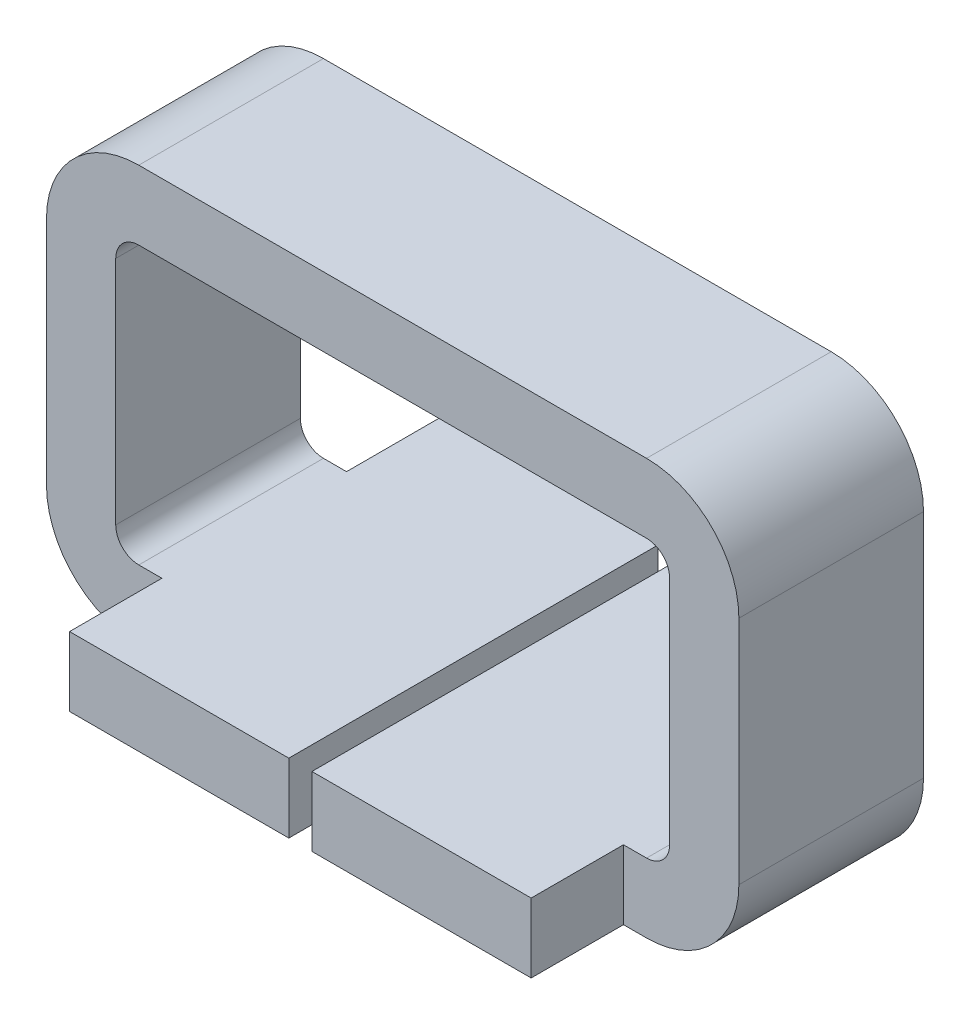
ISO-10303-21;
HEADER;
FILE_DESCRIPTION(('STEP AP214'),'2;1');
FILE_NAME('part.step','',(''),(''),'','','');
FILE_SCHEMA(('AUTOMOTIVE_DESIGN { 1 0 10303 214 1 1 1 1 }'));
ENDSEC;
DATA;
#1=APPLICATION_CONTEXT('core data for automotive mechanical design processes');
#2=APPLICATION_PROTOCOL_DEFINITION('international standard','automotive_design',2000,#1);
#3=PRODUCT_CONTEXT('',#1,'mechanical');
#4=PRODUCT('Part','Part','',(#3));
#5=PRODUCT_RELATED_PRODUCT_CATEGORY('part','',(#4));
#6=PRODUCT_DEFINITION_FORMATION('','',#4);
#7=PRODUCT_DEFINITION_CONTEXT('part definition',#1,'design');
#8=PRODUCT_DEFINITION('design','',#6,#7);
#9=PRODUCT_DEFINITION_SHAPE('','',#8);
#10=(LENGTH_UNIT() NAMED_UNIT(*) SI_UNIT(.MILLI.,.METRE.));
#11=(NAMED_UNIT(*) PLANE_ANGLE_UNIT() SI_UNIT($,.RADIAN.));
#12=(NAMED_UNIT(*) SI_UNIT($,.STERADIAN.) SOLID_ANGLE_UNIT());
#13=UNCERTAINTY_MEASURE_WITH_UNIT(LENGTH_MEASURE(1.E-05),#10,'distance_accuracy_value','');
#14=(GEOMETRIC_REPRESENTATION_CONTEXT(3) GLOBAL_UNCERTAINTY_ASSIGNED_CONTEXT((#13)) GLOBAL_UNIT_ASSIGNED_CONTEXT((#10,
#11,#12)) REPRESENTATION_CONTEXT('',''));
#15=CARTESIAN_POINT('',(0.,0.,0.));
#16=DIRECTION('',(0.,0.,1.));
#17=DIRECTION('',(1.,0.,0.));
#18=AXIS2_PLACEMENT_3D('',#15,#16,#17);
#19=CARTESIAN_POINT('',(-1.397,0.,-0.508));
#20=DIRECTION('',(0.,-1.,0.));
#21=DIRECTION('',(0.,0.,-1.));
#22=AXIS2_PLACEMENT_3D('',#19,#20,#21);
#23=PLANE('',#22);
#24=DIRECTION('',(0.,0.,-1.));
#25=VECTOR('',#24,1.);
#26=CARTESIAN_POINT('',(-0.0635,0.,-1.016));
#27=LINE('',#26,#25);
#28=CARTESIAN_POINT('',(-0.0635,0.,1.016));
#29=VERTEX_POINT('',#28);
#30=CARTESIAN_POINT('',(-0.0635000000000002,0.,-1.016));
#31=VERTEX_POINT('',#30);
#32=EDGE_CURVE('E53',#29,#31,#27,.T.);
#33=ORIENTED_EDGE('',*,*,#32,.F.);
#34=DIRECTION('',(-1.,0.,0.));
#35=VECTOR('',#34,1.);
#36=CARTESIAN_POINT('',(1.27,0.,1.016));
#37=LINE('',#36,#35);
#38=CARTESIAN_POINT('',(-1.27,0.,1.016));
#39=VERTEX_POINT('',#38);
#40=EDGE_CURVE('E263',#29,#39,#37,.T.);
#41=ORIENTED_EDGE('',*,*,#40,.T.);
#42=DIRECTION('',(0.,0.,-1.));
#43=VECTOR('',#42,1.);
#44=CARTESIAN_POINT('',(-1.27,0.,-1.016));
#45=LINE('',#44,#43);
#46=CARTESIAN_POINT('',(-1.27,0.,0.508));
#47=VERTEX_POINT('',#46);
#48=EDGE_CURVE('E247',#39,#47,#45,.T.);
#49=ORIENTED_EDGE('',*,*,#48,.T.);
#50=DIRECTION('',(1.,0.,0.));
#51=VECTOR('',#50,1.);
#52=CARTESIAN_POINT('',(-1.397,0.,0.508));
#53=LINE('',#52,#51);
#54=CARTESIAN_POINT('',(-1.397,0.,0.508));
#55=VERTEX_POINT('',#54);
#56=EDGE_CURVE('E346',#55,#47,#53,.T.);
#57=ORIENTED_EDGE('',*,*,#56,.F.);
#58=DIRECTION('',(0.,0.,1.));
#59=VECTOR('',#58,1.);
#60=CARTESIAN_POINT('',(-1.397,0.,-0.508));
#61=LINE('',#60,#59);
#62=CARTESIAN_POINT('',(-1.397,0.,-0.508));
#63=VERTEX_POINT('',#62);
#64=EDGE_CURVE('E459',#63,#55,#61,.T.);
#65=ORIENTED_EDGE('',*,*,#64,.F.);
#66=DIRECTION('',(1.,0.,0.));
#67=VECTOR('',#66,1.);
#68=CARTESIAN_POINT('',(-1.397,0.,-0.508));
#69=LINE('',#68,#67);
#70=CARTESIAN_POINT('',(-1.27,0.,-0.508));
#71=VERTEX_POINT('',#70);
#72=EDGE_CURVE('E436',#63,#71,#69,.T.);
#73=ORIENTED_EDGE('',*,*,#72,.T.);
#74=CARTESIAN_POINT('',(-1.27,0.,-1.016));
#75=VERTEX_POINT('',#74);
#76=EDGE_CURVE('E256',#71,#75,#45,.T.);
#77=ORIENTED_EDGE('',*,*,#76,.T.);
#78=DIRECTION('',(1.,0.,0.));
#79=VECTOR('',#78,1.);
#80=CARTESIAN_POINT('',(1.27,0.,-1.016));
#81=LINE('',#80,#79);
#82=EDGE_CURVE('E246',#75,#31,#81,.T.);
#83=ORIENTED_EDGE('',*,*,#82,.T.);
#84=EDGE_LOOP('',(#33,#41,#49,#57,#65,#73,#77,#83));
#85=FACE_BOUND('',#84,.T.);
#86=ADVANCED_FACE('F38',(#85),#23,.T.);
#87=CARTESIAN_POINT('',(-1.397,0.381,-0.508));
#88=DIRECTION('',(0.,-1.,0.));
#89=DIRECTION('',(0.,0.,-1.));
#90=AXIS2_PLACEMENT_3D('',#87,#88,#89);
#91=PLANE('',#90);
#92=DIRECTION('',(1.,0.,0.));
#93=VECTOR('',#92,1.);
#94=CARTESIAN_POINT('',(1.27,0.381,1.016));
#95=LINE('',#94,#93);
#96=CARTESIAN_POINT('',(-1.27,0.381,1.016));
#97=VERTEX_POINT('',#96);
#98=CARTESIAN_POINT('',(-0.0635,0.381,1.016));
#99=VERTEX_POINT('',#98);
#100=EDGE_CURVE('E545',#97,#99,#95,.T.);
#101=ORIENTED_EDGE('',*,*,#100,.T.);
#102=DIRECTION('',(0.,0.,-1.));
#103=VECTOR('',#102,1.);
#104=CARTESIAN_POINT('',(-0.0635,0.381,-0.508));
#105=LINE('',#104,#103);
#106=CARTESIAN_POINT('',(-0.0635,0.381,-1.016));
#107=VERTEX_POINT('',#106);
#108=EDGE_CURVE('E529',#99,#107,#105,.T.);
#109=ORIENTED_EDGE('',*,*,#108,.T.);
#110=DIRECTION('',(-1.,0.,0.));
#111=VECTOR('',#110,1.);
#112=CARTESIAN_POINT('',(1.27,0.381,-1.016));
#113=LINE('',#112,#111);
#114=CARTESIAN_POINT('',(-1.27,0.381,-1.016));
#115=VERTEX_POINT('',#114);
#116=EDGE_CURVE('E285',#107,#115,#113,.T.);
#117=ORIENTED_EDGE('',*,*,#116,.T.);
#118=DIRECTION('',(0.,0.,1.));
#119=VECTOR('',#118,1.);
#120=CARTESIAN_POINT('',(-1.27,0.381,-1.016));
#121=LINE('',#120,#119);
#122=CARTESIAN_POINT('',(-1.27,0.381,-0.508));
#123=VERTEX_POINT('',#122);
#124=EDGE_CURVE('E526',#115,#123,#121,.T.);
#125=ORIENTED_EDGE('',*,*,#124,.T.);
#126=DIRECTION('',(1.,0.,0.));
#127=VECTOR('',#126,1.);
#128=CARTESIAN_POINT('',(-1.397,0.381,-0.508));
#129=LINE('',#128,#127);
#130=CARTESIAN_POINT('',(-1.397,0.381,-0.508));
#131=VERTEX_POINT('',#130);
#132=EDGE_CURVE('E371',#131,#123,#129,.T.);
#133=ORIENTED_EDGE('',*,*,#132,.F.);
#134=DIRECTION('',(0.,0.,1.));
#135=VECTOR('',#134,1.);
#136=CARTESIAN_POINT('',(-1.397,0.381,-0.508));
#137=LINE('',#136,#135);
#138=CARTESIAN_POINT('',(-1.397,0.381,0.508));
#139=VERTEX_POINT('',#138);
#140=EDGE_CURVE('E408',#131,#139,#137,.T.);
#141=ORIENTED_EDGE('',*,*,#140,.T.);
#142=DIRECTION('',(1.,0.,0.));
#143=VECTOR('',#142,1.);
#144=CARTESIAN_POINT('',(-1.397,0.381,0.508));
#145=LINE('',#144,#143);
#146=CARTESIAN_POINT('',(-1.27,0.381,0.508));
#147=VERTEX_POINT('',#146);
#148=EDGE_CURVE('E306',#139,#147,#145,.T.);
#149=ORIENTED_EDGE('',*,*,#148,.T.);
#150=EDGE_CURVE('E488',#147,#97,#121,.T.);
#151=ORIENTED_EDGE('',*,*,#150,.T.);
#152=EDGE_LOOP('',(#101,#109,#117,#125,#133,#141,#149,#151));
#153=FACE_BOUND('',#152,.T.);
#154=ADVANCED_FACE('F487',(#153),#91,.F.);
#155=CARTESIAN_POINT('',(1.27,3.63378711261589,1.016));
#156=DIRECTION('',(0.,0.,1.));
#157=DIRECTION('',(1.,0.,0.));
#158=AXIS2_PLACEMENT_3D('',#155,#156,#157);
#159=PLANE('',#158);
#160=DIRECTION('',(0.,-1.,0.));
#161=VECTOR('',#160,1.);
#162=CARTESIAN_POINT('',(-0.0635,0.508,1.016));
#163=LINE('',#162,#161);
#164=EDGE_CURVE('E537',#99,#29,#163,.T.);
#165=ORIENTED_EDGE('',*,*,#164,.F.);
#166=ORIENTED_EDGE('',*,*,#100,.F.);
#167=DIRECTION('',(0.,-1.,0.));
#168=VECTOR('',#167,1.);
#169=CARTESIAN_POINT('',(-1.27,3.63378711261589,1.016));
#170=LINE('',#169,#168);
#171=EDGE_CURVE('E267',#97,#39,#170,.T.);
#172=ORIENTED_EDGE('',*,*,#171,.T.);
#173=ORIENTED_EDGE('',*,*,#40,.F.);
#174=EDGE_LOOP('',(#165,#166,#172,#173));
#175=FACE_BOUND('',#174,.T.);
#176=ADVANCED_FACE('F605',(#175),#159,.T.);
#177=CARTESIAN_POINT('',(1.27,3.63378711261589,-1.016));
#178=DIRECTION('',(0.,0.,-1.));
#179=DIRECTION('',(-1.,0.,0.));
#180=AXIS2_PLACEMENT_3D('',#177,#178,#179);
#181=PLANE('',#180);
#182=DIRECTION('',(0.,1.,0.));
#183=VECTOR('',#182,1.);
#184=CARTESIAN_POINT('',(-0.0635,3.63378711261589,-1.016));
#185=LINE('',#184,#183);
#186=EDGE_CURVE('E11',#31,#107,#185,.T.);
#187=ORIENTED_EDGE('',*,*,#186,.F.);
#188=ORIENTED_EDGE('',*,*,#82,.F.);
#189=DIRECTION('',(0.,-1.,0.));
#190=VECTOR('',#189,1.);
#191=CARTESIAN_POINT('',(-1.27,3.63378711261589,-1.016));
#192=LINE('',#191,#190);
#193=EDGE_CURVE('E266',#115,#75,#192,.T.);
#194=ORIENTED_EDGE('',*,*,#193,.F.);
#195=ORIENTED_EDGE('',*,*,#116,.F.);
#196=EDGE_LOOP('',(#187,#188,#194,#195));
#197=FACE_BOUND('',#196,.T.);
#198=ADVANCED_FACE('F610',(#197),#181,.T.);
#199=CARTESIAN_POINT('',(1.397,1.778,-0.508));
#200=DIRECTION('',(0.,0.,1.));
#201=DIRECTION('',(1.,0.,0.));
#202=AXIS2_PLACEMENT_3D('',#199,#200,#201);
#203=CYLINDRICAL_SURFACE('',#202,0.508);
#204=DIRECTION('',(0.,0.,1.));
#205=VECTOR('',#204,1.);
#206=CARTESIAN_POINT('',(1.397,2.286,-0.508));
#207=LINE('',#206,#205);
#208=CARTESIAN_POINT('',(1.397,2.286,-0.508));
#209=VERTEX_POINT('',#208);
#210=CARTESIAN_POINT('',(1.397,2.286,0.508));
#211=VERTEX_POINT('',#210);
#212=EDGE_CURVE('E447',#209,#211,#207,.T.);
#213=ORIENTED_EDGE('',*,*,#212,.T.);
#214=CARTESIAN_POINT('',(1.397,1.778,0.508));
#215=DIRECTION('',(0.,0.,1.));
#216=DIRECTION('',(-1.,0.,0.));
#217=AXIS2_PLACEMENT_3D('',#214,#215,#216);
#218=CIRCLE('',#217,0.508);
#219=CARTESIAN_POINT('',(1.905,1.778,0.508));
#220=VERTEX_POINT('',#219);
#221=EDGE_CURVE('E325',#220,#211,#218,.T.);
#222=ORIENTED_EDGE('',*,*,#221,.F.);
#223=DIRECTION('',(0.,0.,1.));
#224=VECTOR('',#223,1.);
#225=CARTESIAN_POINT('',(1.905,1.778,-0.508));
#226=LINE('',#225,#224);
#227=CARTESIAN_POINT('',(1.905,1.778,-0.508));
#228=VERTEX_POINT('',#227);
#229=EDGE_CURVE('E448',#228,#220,#226,.T.);
#230=ORIENTED_EDGE('',*,*,#229,.F.);
#231=CARTESIAN_POINT('',(1.397,1.778,-0.508));
#232=DIRECTION('',(0.,0.,1.));
#233=DIRECTION('',(-1.,0.,0.));
#234=AXIS2_PLACEMENT_3D('',#231,#232,#233);
#235=CIRCLE('',#234,0.508);
#236=EDGE_CURVE('E394',#228,#209,#235,.T.);
#237=ORIENTED_EDGE('',*,*,#236,.T.);
#238=EDGE_LOOP('',(#213,#222,#230,#237));
#239=FACE_BOUND('',#238,.T.);
#240=ADVANCED_FACE('F40',(#239),#203,.T.);
#241=CARTESIAN_POINT('',(1.905,1.778,-0.508));
#242=DIRECTION('',(1.,0.,0.));
#243=DIRECTION('',(0.,1.,0.));
#244=AXIS2_PLACEMENT_3D('',#241,#242,#243);
#245=PLANE('',#244);
#246=ORIENTED_EDGE('',*,*,#229,.T.);
#247=DIRECTION('',(0.,1.,0.));
#248=VECTOR('',#247,1.);
#249=CARTESIAN_POINT('',(1.905,1.778,0.508));
#250=LINE('',#249,#248);
#251=CARTESIAN_POINT('',(1.905,0.508,0.508));
#252=VERTEX_POINT('',#251);
#253=EDGE_CURVE('E354',#252,#220,#250,.T.);
#254=ORIENTED_EDGE('',*,*,#253,.F.);
#255=DIRECTION('',(0.,0.,1.));
#256=VECTOR('',#255,1.);
#257=CARTESIAN_POINT('',(1.905,0.508,-0.508));
#258=LINE('',#257,#256);
#259=CARTESIAN_POINT('',(1.905,0.508,-0.508));
#260=VERTEX_POINT('',#259);
#261=EDGE_CURVE('E452',#260,#252,#258,.T.);
#262=ORIENTED_EDGE('',*,*,#261,.F.);
#263=DIRECTION('',(0.,1.,0.));
#264=VECTOR('',#263,1.);
#265=CARTESIAN_POINT('',(1.905,1.778,-0.508));
#266=LINE('',#265,#264);
#267=EDGE_CURVE('E443',#260,#228,#266,.T.);
#268=ORIENTED_EDGE('',*,*,#267,.T.);
#269=EDGE_LOOP('',(#246,#254,#262,#268));
#270=FACE_BOUND('',#269,.T.);
#271=ADVANCED_FACE('F579',(#270),#245,.T.);
#272=CARTESIAN_POINT('',(1.397,0.508,-0.508));
#273=DIRECTION('',(0.,0.,1.));
#274=DIRECTION('',(1.,0.,0.));
#275=AXIS2_PLACEMENT_3D('',#272,#273,#274);
#276=CYLINDRICAL_SURFACE('',#275,0.508);
#277=ORIENTED_EDGE('',*,*,#261,.T.);
#278=CARTESIAN_POINT('',(1.397,0.508,0.508));
#279=DIRECTION('',(0.,0.,1.));
#280=DIRECTION('',(-1.,0.,0.));
#281=AXIS2_PLACEMENT_3D('',#278,#279,#280);
#282=CIRCLE('',#281,0.508);
#283=CARTESIAN_POINT('',(1.397,0.,0.508));
#284=VERTEX_POINT('',#283);
#285=EDGE_CURVE('E350',#284,#252,#282,.T.);
#286=ORIENTED_EDGE('',*,*,#285,.F.);
#287=DIRECTION('',(0.,0.,1.));
#288=VECTOR('',#287,1.);
#289=CARTESIAN_POINT('',(1.397,0.,-0.508));
#290=LINE('',#289,#288);
#291=CARTESIAN_POINT('',(1.397,0.,-0.508));
#292=VERTEX_POINT('',#291);
#293=EDGE_CURVE('E455',#292,#284,#290,.T.);
#294=ORIENTED_EDGE('',*,*,#293,.F.);
#295=CARTESIAN_POINT('',(1.397,0.508,-0.508));
#296=DIRECTION('',(0.,0.,1.));
#297=DIRECTION('',(-1.,0.,0.));
#298=AXIS2_PLACEMENT_3D('',#295,#296,#297);
#299=CIRCLE('',#298,0.508);
#300=EDGE_CURVE('E440',#292,#260,#299,.T.);
#301=ORIENTED_EDGE('',*,*,#300,.T.);
#302=EDGE_LOOP('',(#277,#286,#294,#301));
#303=FACE_BOUND('',#302,.T.);
#304=ADVANCED_FACE('F573',(#303),#276,.T.);
#305=DIRECTION('',(0.,0.,1.));
#306=VECTOR('',#305,1.);
#307=CARTESIAN_POINT('',(0.0635,0.,-1.016));
#308=LINE('',#307,#306);
#309=CARTESIAN_POINT('',(0.0635,0.,-1.016));
#310=VERTEX_POINT('',#309);
#311=CARTESIAN_POINT('',(0.0635,0.,1.016));
#312=VERTEX_POINT('',#311);
#313=EDGE_CURVE('E222',#310,#312,#308,.T.);
#314=ORIENTED_EDGE('',*,*,#313,.F.);
#315=CARTESIAN_POINT('',(1.27,0.,-1.016));
#316=VERTEX_POINT('',#315);
#317=EDGE_CURVE('E234',#310,#316,#81,.T.);
#318=ORIENTED_EDGE('',*,*,#317,.T.);
#319=DIRECTION('',(0.,0.,1.));
#320=VECTOR('',#319,1.);
#321=CARTESIAN_POINT('',(1.27,0.,-1.016));
#322=LINE('',#321,#320);
#323=CARTESIAN_POINT('',(1.27,0.,-0.508));
#324=VERTEX_POINT('',#323);
#325=EDGE_CURVE('E260',#316,#324,#322,.T.);
#326=ORIENTED_EDGE('',*,*,#325,.T.);
#327=EDGE_CURVE('E435',#324,#292,#69,.T.);
#328=ORIENTED_EDGE('',*,*,#327,.T.);
#329=ORIENTED_EDGE('',*,*,#293,.T.);
#330=CARTESIAN_POINT('',(1.27,0.,0.508));
#331=VERTEX_POINT('',#330);
#332=EDGE_CURVE('E345',#331,#284,#53,.T.);
#333=ORIENTED_EDGE('',*,*,#332,.F.);
#334=CARTESIAN_POINT('',(1.27,0.,1.016));
#335=VERTEX_POINT('',#334);
#336=EDGE_CURVE('E253',#331,#335,#322,.T.);
#337=ORIENTED_EDGE('',*,*,#336,.T.);
#338=EDGE_CURVE('E237',#335,#312,#37,.T.);
#339=ORIENTED_EDGE('',*,*,#338,.T.);
#340=EDGE_LOOP('',(#314,#318,#326,#328,#329,#333,#337,#339));
#341=FACE_BOUND('',#340,.T.);
#342=ADVANCED_FACE('F232',(#341),#23,.T.);
#343=CARTESIAN_POINT('',(-1.397,0.508,-0.508));
#344=DIRECTION('',(0.,0.,1.));
#345=DIRECTION('',(1.,0.,0.));
#346=AXIS2_PLACEMENT_3D('',#343,#344,#345);
#347=CYLINDRICAL_SURFACE('',#346,0.508);
#348=ORIENTED_EDGE('',*,*,#64,.T.);
#349=CARTESIAN_POINT('',(-1.397,0.508,0.508));
#350=DIRECTION('',(0.,0.,1.));
#351=DIRECTION('',(-1.,0.,0.));
#352=AXIS2_PLACEMENT_3D('',#349,#350,#351);
#353=CIRCLE('',#352,0.508);
#354=CARTESIAN_POINT('',(-1.905,0.508,0.508));
#355=VERTEX_POINT('',#354);
#356=EDGE_CURVE('E341',#355,#55,#353,.T.);
#357=ORIENTED_EDGE('',*,*,#356,.F.);
#358=DIRECTION('',(0.,0.,1.));
#359=VECTOR('',#358,1.);
#360=CARTESIAN_POINT('',(-1.905,0.508,-0.508));
#361=LINE('',#360,#359);
#362=CARTESIAN_POINT('',(-1.905,0.508,-0.508));
#363=VERTEX_POINT('',#362);
#364=EDGE_CURVE('E462',#363,#355,#361,.T.);
#365=ORIENTED_EDGE('',*,*,#364,.F.);
#366=CARTESIAN_POINT('',(-1.397,0.508,-0.508));
#367=DIRECTION('',(0.,0.,1.));
#368=DIRECTION('',(-1.,0.,0.));
#369=AXIS2_PLACEMENT_3D('',#366,#367,#368);
#370=CIRCLE('',#369,0.508);
#371=EDGE_CURVE('E431',#363,#63,#370,.T.);
#372=ORIENTED_EDGE('',*,*,#371,.T.);
#373=EDGE_LOOP('',(#348,#357,#365,#372));
#374=FACE_BOUND('',#373,.T.);
#375=ADVANCED_FACE('F598',(#374),#347,.T.);
#376=CARTESIAN_POINT('',(-1.905,1.778,-0.508));
#377=DIRECTION('',(-1.,0.,0.));
#378=DIRECTION('',(0.,-1.,0.));
#379=AXIS2_PLACEMENT_3D('',#376,#377,#378);
#380=PLANE('',#379);
#381=ORIENTED_EDGE('',*,*,#364,.T.);
#382=DIRECTION('',(0.,-1.,0.));
#383=VECTOR('',#382,1.);
#384=CARTESIAN_POINT('',(-1.905,1.778,0.508));
#385=LINE('',#384,#383);
#386=CARTESIAN_POINT('',(-1.905,1.778,0.508));
#387=VERTEX_POINT('',#386);
#388=EDGE_CURVE('E337',#387,#355,#385,.T.);
#389=ORIENTED_EDGE('',*,*,#388,.F.);
#390=DIRECTION('',(0.,0.,1.));
#391=VECTOR('',#390,1.);
#392=CARTESIAN_POINT('',(-1.905,1.778,-0.508));
#393=LINE('',#392,#391);
#394=CARTESIAN_POINT('',(-1.905,1.778,-0.508));
#395=VERTEX_POINT('',#394);
#396=EDGE_CURVE('E465',#395,#387,#393,.T.);
#397=ORIENTED_EDGE('',*,*,#396,.F.);
#398=DIRECTION('',(0.,-1.,0.));
#399=VECTOR('',#398,1.);
#400=CARTESIAN_POINT('',(-1.905,1.778,-0.508));
#401=LINE('',#400,#399);
#402=EDGE_CURVE('E427',#395,#363,#401,.T.);
#403=ORIENTED_EDGE('',*,*,#402,.T.);
#404=EDGE_LOOP('',(#381,#389,#397,#403));
#405=FACE_BOUND('',#404,.T.);
#406=ADVANCED_FACE('F594',(#405),#380,.T.);
#407=CARTESIAN_POINT('',(-1.397,1.778,-0.508));
#408=DIRECTION('',(0.,0.,1.));
#409=DIRECTION('',(1.,0.,0.));
#410=AXIS2_PLACEMENT_3D('',#407,#408,#409);
#411=CYLINDRICAL_SURFACE('',#410,0.508);
#412=ORIENTED_EDGE('',*,*,#396,.T.);
#413=CARTESIAN_POINT('',(-1.397,1.778,0.508));
#414=DIRECTION('',(0.,0.,1.));
#415=DIRECTION('',(-1.,0.,0.));
#416=AXIS2_PLACEMENT_3D('',#413,#414,#415);
#417=CIRCLE('',#416,0.508);
#418=CARTESIAN_POINT('',(-1.397,2.286,0.508));
#419=VERTEX_POINT('',#418);
#420=EDGE_CURVE('E333',#419,#387,#417,.T.);
#421=ORIENTED_EDGE('',*,*,#420,.F.);
#422=DIRECTION('',(0.,0.,1.));
#423=VECTOR('',#422,1.);
#424=CARTESIAN_POINT('',(-1.397,2.286,-0.508));
#425=LINE('',#424,#423);
#426=CARTESIAN_POINT('',(-1.397,2.286,-0.508));
#427=VERTEX_POINT('',#426);
#428=EDGE_CURVE('E468',#427,#419,#425,.T.);
#429=ORIENTED_EDGE('',*,*,#428,.F.);
#430=CARTESIAN_POINT('',(-1.397,1.778,-0.508));
#431=DIRECTION('',(0.,0.,1.));
#432=DIRECTION('',(-1.,0.,0.));
#433=AXIS2_PLACEMENT_3D('',#430,#431,#432);
#434=CIRCLE('',#433,0.508);
#435=EDGE_CURVE('E423',#427,#395,#434,.T.);
#436=ORIENTED_EDGE('',*,*,#435,.T.);
#437=EDGE_LOOP('',(#412,#421,#429,#436));
#438=FACE_BOUND('',#437,.T.);
#439=ADVANCED_FACE('F590',(#438),#411,.T.);
#440=CARTESIAN_POINT('',(-1.397,2.286,-0.508));
#441=DIRECTION('',(0.,1.,0.));
#442=DIRECTION('',(-1.,0.,0.));
#443=AXIS2_PLACEMENT_3D('',#440,#441,#442);
#444=PLANE('',#443);
#445=ORIENTED_EDGE('',*,*,#428,.T.);
#446=DIRECTION('',(-1.,0.,0.));
#447=VECTOR('',#446,1.);
#448=CARTESIAN_POINT('',(-1.397,2.286,0.508));
#449=LINE('',#448,#447);
#450=EDGE_CURVE('E329',#211,#419,#449,.T.);
#451=ORIENTED_EDGE('',*,*,#450,.F.);
#452=ORIENTED_EDGE('',*,*,#212,.F.);
#453=DIRECTION('',(-1.,0.,0.));
#454=VECTOR('',#453,1.);
#455=CARTESIAN_POINT('',(-1.397,2.286,-0.508));
#456=LINE('',#455,#454);
#457=EDGE_CURVE('E419',#209,#427,#456,.T.);
#458=ORIENTED_EDGE('',*,*,#457,.T.);
#459=EDGE_LOOP('',(#445,#451,#452,#458));
#460=FACE_BOUND('',#459,.T.);
#461=ADVANCED_FACE('F586',(#460),#444,.T.);
#462=CARTESIAN_POINT('',(1.397,1.778,-0.508));
#463=DIRECTION('',(0.,0.,-1.));
#464=DIRECTION('',(-1.,0.,0.));
#465=AXIS2_PLACEMENT_3D('',#462,#463,#464);
#466=PLANE('',#465);
#467=DIRECTION('',(0.,1.,0.));
#468=VECTOR('',#467,1.);
#469=CARTESIAN_POINT('',(-1.27,1.778,-0.508));
#470=LINE('',#469,#468);
#471=EDGE_CURVE('E289',#71,#123,#470,.T.);
#472=ORIENTED_EDGE('',*,*,#471,.F.);
#473=ORIENTED_EDGE('',*,*,#72,.F.);
#474=ORIENTED_EDGE('',*,*,#371,.F.);
#475=ORIENTED_EDGE('',*,*,#402,.F.);
#476=ORIENTED_EDGE('',*,*,#435,.F.);
#477=ORIENTED_EDGE('',*,*,#457,.F.);
#478=ORIENTED_EDGE('',*,*,#236,.F.);
#479=ORIENTED_EDGE('',*,*,#267,.F.);
#480=ORIENTED_EDGE('',*,*,#300,.F.);
#481=ORIENTED_EDGE('',*,*,#327,.F.);
#482=DIRECTION('',(0.,-1.,0.));
#483=VECTOR('',#482,1.);
#484=CARTESIAN_POINT('',(1.27,1.778,-0.508));
#485=LINE('',#484,#483);
#486=CARTESIAN_POINT('',(1.27,0.381,-0.508));
#487=VERTEX_POINT('',#486);
#488=EDGE_CURVE('E284',#487,#324,#485,.T.);
#489=ORIENTED_EDGE('',*,*,#488,.F.);
#490=CARTESIAN_POINT('',(1.397,0.381,-0.508));
#491=VERTEX_POINT('',#490);
#492=EDGE_CURVE('E370',#487,#491,#129,.T.);
#493=ORIENTED_EDGE('',*,*,#492,.T.);
#494=CARTESIAN_POINT('',(1.397,0.508,-0.508));
#495=DIRECTION('',(0.,0.,1.));
#496=DIRECTION('',(-1.,0.,0.));
#497=AXIS2_PLACEMENT_3D('',#494,#495,#496);
#498=CIRCLE('',#497,0.127);
#499=CARTESIAN_POINT('',(1.524,0.508,-0.508));
#500=VERTEX_POINT('',#499);
#501=EDGE_CURVE('E374',#491,#500,#498,.T.);
#502=ORIENTED_EDGE('',*,*,#501,.T.);
#503=DIRECTION('',(0.,1.,0.));
#504=VECTOR('',#503,1.);
#505=CARTESIAN_POINT('',(1.524,1.778,-0.508));
#506=LINE('',#505,#504);
#507=CARTESIAN_POINT('',(1.524,1.778,-0.508));
#508=VERTEX_POINT('',#507);
#509=EDGE_CURVE('E378',#500,#508,#506,.T.);
#510=ORIENTED_EDGE('',*,*,#509,.T.);
#511=CARTESIAN_POINT('',(1.397,1.778,-0.508));
#512=DIRECTION('',(0.,0.,1.));
#513=DIRECTION('',(-1.,0.,0.));
#514=AXIS2_PLACEMENT_3D('',#511,#512,#513);
#515=CIRCLE('',#514,0.127);
#516=CARTESIAN_POINT('',(1.397,1.905,-0.508));
#517=VERTEX_POINT('',#516);
#518=EDGE_CURVE('E382',#508,#517,#515,.T.);
#519=ORIENTED_EDGE('',*,*,#518,.T.);
#520=DIRECTION('',(-1.,0.,0.));
#521=VECTOR('',#520,1.);
#522=CARTESIAN_POINT('',(-1.397,1.905,-0.508));
#523=LINE('',#522,#521);
#524=CARTESIAN_POINT('',(-1.397,1.905,-0.508));
#525=VERTEX_POINT('',#524);
#526=EDGE_CURVE('E386',#517,#525,#523,.T.);
#527=ORIENTED_EDGE('',*,*,#526,.T.);
#528=CARTESIAN_POINT('',(-1.397,1.778,-0.508));
#529=DIRECTION('',(0.,0.,1.));
#530=DIRECTION('',(-1.,0.,0.));
#531=AXIS2_PLACEMENT_3D('',#528,#529,#530);
#532=CIRCLE('',#531,0.127);
#533=CARTESIAN_POINT('',(-1.524,1.778,-0.508));
#534=VERTEX_POINT('',#533);
#535=EDGE_CURVE('E358',#525,#534,#532,.T.);
#536=ORIENTED_EDGE('',*,*,#535,.T.);
#537=DIRECTION('',(0.,-1.,0.));
#538=VECTOR('',#537,1.);
#539=CARTESIAN_POINT('',(-1.524,1.778,-0.508));
#540=LINE('',#539,#538);
#541=CARTESIAN_POINT('',(-1.524,0.508,-0.508));
#542=VERTEX_POINT('',#541);
#543=EDGE_CURVE('E362',#534,#542,#540,.T.);
#544=ORIENTED_EDGE('',*,*,#543,.T.);
#545=CARTESIAN_POINT('',(-1.397,0.508,-0.508));
#546=DIRECTION('',(0.,0.,1.));
#547=DIRECTION('',(-1.,0.,0.));
#548=AXIS2_PLACEMENT_3D('',#545,#546,#547);
#549=CIRCLE('',#548,0.127);
#550=EDGE_CURVE('E366',#542,#131,#549,.T.);
#551=ORIENTED_EDGE('',*,*,#550,.T.);
#552=ORIENTED_EDGE('',*,*,#132,.T.);
#553=EDGE_LOOP('',(#472,#473,#474,#475,#476,#477,#478,#479,#480,#481,#489,#493,#502,#510,#519,
#527,#536,#544,#551,#552));
#554=FACE_BOUND('',#553,.T.);
#555=ADVANCED_FACE('F575',(#554),#466,.T.);
#556=CARTESIAN_POINT('',(-1.397,1.778,-0.508));
#557=DIRECTION('',(0.,0.,1.));
#558=DIRECTION('',(1.,0.,0.));
#559=AXIS2_PLACEMENT_3D('',#556,#557,#558);
#560=CYLINDRICAL_SURFACE('',#559,0.127);
#561=DIRECTION('',(0.,0.,1.));
#562=VECTOR('',#561,1.);
#563=CARTESIAN_POINT('',(-1.397,1.905,-0.508));
#564=LINE('',#563,#562);
#565=CARTESIAN_POINT('',(-1.397,1.905,0.508));
#566=VERTEX_POINT('',#565);
#567=EDGE_CURVE('E391',#525,#566,#564,.T.);
#568=ORIENTED_EDGE('',*,*,#567,.T.);
#569=CARTESIAN_POINT('',(-1.397,1.778,0.508));
#570=DIRECTION('',(0.,0.,1.));
#571=DIRECTION('',(-1.,0.,0.));
#572=AXIS2_PLACEMENT_3D('',#569,#570,#571);
#573=CIRCLE('',#572,0.127);
#574=CARTESIAN_POINT('',(-1.524,1.778,0.508));
#575=VERTEX_POINT('',#574);
#576=EDGE_CURVE('E293',#566,#575,#573,.T.);
#577=ORIENTED_EDGE('',*,*,#576,.T.);
#578=DIRECTION('',(0.,0.,1.));
#579=VECTOR('',#578,1.);
#580=CARTESIAN_POINT('',(-1.524,1.778,-0.508));
#581=LINE('',#580,#579);
#582=EDGE_CURVE('E390',#534,#575,#581,.T.);
#583=ORIENTED_EDGE('',*,*,#582,.F.);
#584=ORIENTED_EDGE('',*,*,#535,.F.);
#585=EDGE_LOOP('',(#568,#577,#583,#584));
#586=FACE_BOUND('',#585,.T.);
#587=ADVANCED_FACE('F503',(#586),#560,.F.);
#588=CARTESIAN_POINT('',(-1.397,1.905,-0.508));
#589=DIRECTION('',(0.,1.,0.));
#590=DIRECTION('',(0.,0.,1.));
#591=AXIS2_PLACEMENT_3D('',#588,#589,#590);
#592=PLANE('',#591);
#593=DIRECTION('',(0.,0.,1.));
#594=VECTOR('',#593,1.);
#595=CARTESIAN_POINT('',(1.397,1.905,-0.508));
#596=LINE('',#595,#594);
#597=CARTESIAN_POINT('',(1.397,1.905,0.508));
#598=VERTEX_POINT('',#597);
#599=EDGE_CURVE('E395',#517,#598,#596,.T.);
#600=ORIENTED_EDGE('',*,*,#599,.T.);
#601=DIRECTION('',(-1.,0.,0.));
#602=VECTOR('',#601,1.);
#603=CARTESIAN_POINT('',(-1.397,1.905,0.508));
#604=LINE('',#603,#602);
#605=EDGE_CURVE('E321',#598,#566,#604,.T.);
#606=ORIENTED_EDGE('',*,*,#605,.T.);
#607=ORIENTED_EDGE('',*,*,#567,.F.);
#608=ORIENTED_EDGE('',*,*,#526,.F.);
#609=EDGE_LOOP('',(#600,#606,#607,#608));
#610=FACE_BOUND('',#609,.T.);
#611=ADVANCED_FACE('F506',(#610),#592,.F.);
#612=CARTESIAN_POINT('',(1.397,1.778,-0.508));
#613=DIRECTION('',(0.,0.,1.));
#614=DIRECTION('',(1.,0.,0.));
#615=AXIS2_PLACEMENT_3D('',#612,#613,#614);
#616=CYLINDRICAL_SURFACE('',#615,0.127);
#617=DIRECTION('',(0.,0.,1.));
#618=VECTOR('',#617,1.);
#619=CARTESIAN_POINT('',(1.524,1.778,-0.508));
#620=LINE('',#619,#618);
#621=CARTESIAN_POINT('',(1.524,1.778,0.508));
#622=VERTEX_POINT('',#621);
#623=EDGE_CURVE('E398',#508,#622,#620,.T.);
#624=ORIENTED_EDGE('',*,*,#623,.T.);
#625=CARTESIAN_POINT('',(1.397,1.778,0.508));
#626=DIRECTION('',(0.,0.,1.));
#627=DIRECTION('',(-1.,0.,0.));
#628=AXIS2_PLACEMENT_3D('',#625,#626,#627);
#629=CIRCLE('',#628,0.127);
#630=EDGE_CURVE('E317',#622,#598,#629,.T.);
#631=ORIENTED_EDGE('',*,*,#630,.T.);
#632=ORIENTED_EDGE('',*,*,#599,.F.);
#633=ORIENTED_EDGE('',*,*,#518,.F.);
#634=EDGE_LOOP('',(#624,#631,#632,#633));
#635=FACE_BOUND('',#634,.T.);
#636=ADVANCED_FACE('F511',(#635),#616,.F.);
#637=CARTESIAN_POINT('',(1.524,1.778,-0.508));
#638=DIRECTION('',(1.,0.,0.));
#639=DIRECTION('',(0.,1.,0.));
#640=AXIS2_PLACEMENT_3D('',#637,#638,#639);
#641=PLANE('',#640);
#642=DIRECTION('',(0.,0.,1.));
#643=VECTOR('',#642,1.);
#644=CARTESIAN_POINT('',(1.524,0.508,-0.508));
#645=LINE('',#644,#643);
#646=CARTESIAN_POINT('',(1.524,0.508,0.508));
#647=VERTEX_POINT('',#646);
#648=EDGE_CURVE('E401',#500,#647,#645,.T.);
#649=ORIENTED_EDGE('',*,*,#648,.T.);
#650=DIRECTION('',(0.,1.,0.));
#651=VECTOR('',#650,1.);
#652=CARTESIAN_POINT('',(1.524,1.778,0.508));
#653=LINE('',#652,#651);
#654=EDGE_CURVE('E314',#647,#622,#653,.T.);
#655=ORIENTED_EDGE('',*,*,#654,.T.);
#656=ORIENTED_EDGE('',*,*,#623,.F.);
#657=ORIENTED_EDGE('',*,*,#509,.F.);
#658=EDGE_LOOP('',(#649,#655,#656,#657));
#659=FACE_BOUND('',#658,.T.);
#660=ADVANCED_FACE('F515',(#659),#641,.F.);
#661=CARTESIAN_POINT('',(1.397,0.508,-0.508));
#662=DIRECTION('',(0.,0.,1.));
#663=DIRECTION('',(1.,0.,0.));
#664=AXIS2_PLACEMENT_3D('',#661,#662,#663);
#665=CYLINDRICAL_SURFACE('',#664,0.127);
#666=DIRECTION('',(0.,0.,1.));
#667=VECTOR('',#666,1.);
#668=CARTESIAN_POINT('',(1.397,0.381,-0.508));
#669=LINE('',#668,#667);
#670=CARTESIAN_POINT('',(1.397,0.381,0.508));
#671=VERTEX_POINT('',#670);
#672=EDGE_CURVE('E404',#491,#671,#669,.T.);
#673=ORIENTED_EDGE('',*,*,#672,.T.);
#674=CARTESIAN_POINT('',(1.397,0.508,0.508));
#675=DIRECTION('',(0.,0.,1.));
#676=DIRECTION('',(-1.,0.,0.));
#677=AXIS2_PLACEMENT_3D('',#674,#675,#676);
#678=CIRCLE('',#677,0.127);
#679=EDGE_CURVE('E310',#671,#647,#678,.T.);
#680=ORIENTED_EDGE('',*,*,#679,.T.);
#681=ORIENTED_EDGE('',*,*,#648,.F.);
#682=ORIENTED_EDGE('',*,*,#501,.F.);
#683=EDGE_LOOP('',(#673,#680,#681,#682));
#684=FACE_BOUND('',#683,.T.);
#685=ADVANCED_FACE('F518',(#684),#665,.F.);
#686=CARTESIAN_POINT('',(1.27,0.381,-1.016));
#687=VERTEX_POINT('',#686);
#688=CARTESIAN_POINT('',(0.0635,0.381,-1.016));
#689=VERTEX_POINT('',#688);
#690=EDGE_CURVE('E281',#687,#689,#113,.T.);
#691=ORIENTED_EDGE('',*,*,#690,.T.);
#692=DIRECTION('',(0.,0.,1.));
#693=VECTOR('',#692,1.);
#694=CARTESIAN_POINT('',(0.0635,0.381,-0.508));
#695=LINE('',#694,#693);
#696=CARTESIAN_POINT('',(0.0635,0.381,1.016));
#697=VERTEX_POINT('',#696);
#698=EDGE_CURVE('E61',#689,#697,#695,.T.);
#699=ORIENTED_EDGE('',*,*,#698,.T.);
#700=CARTESIAN_POINT('',(1.27,0.381,1.016));
#701=VERTEX_POINT('',#700);
#702=EDGE_CURVE('E544',#697,#701,#95,.T.);
#703=ORIENTED_EDGE('',*,*,#702,.T.);
#704=DIRECTION('',(0.,0.,-1.));
#705=VECTOR('',#704,1.);
#706=CARTESIAN_POINT('',(1.27,0.381,-1.016));
#707=LINE('',#706,#705);
#708=CARTESIAN_POINT('',(1.27,0.381,0.508));
#709=VERTEX_POINT('',#708);
#710=EDGE_CURVE('E541',#701,#709,#707,.T.);
#711=ORIENTED_EDGE('',*,*,#710,.T.);
#712=EDGE_CURVE('E305',#709,#671,#145,.T.);
#713=ORIENTED_EDGE('',*,*,#712,.T.);
#714=ORIENTED_EDGE('',*,*,#672,.F.);
#715=ORIENTED_EDGE('',*,*,#492,.F.);
#716=EDGE_CURVE('E271',#487,#687,#707,.T.);
#717=ORIENTED_EDGE('',*,*,#716,.T.);
#718=EDGE_LOOP('',(#691,#699,#703,#711,#713,#714,#715,#717));
#719=FACE_BOUND('',#718,.T.);
#720=ADVANCED_FACE('F552',(#719),#91,.F.);
#721=CARTESIAN_POINT('',(-1.397,0.508,-0.508));
#722=DIRECTION('',(0.,0.,1.));
#723=DIRECTION('',(1.,0.,0.));
#724=AXIS2_PLACEMENT_3D('',#721,#722,#723);
#725=CYLINDRICAL_SURFACE('',#724,0.127);
#726=DIRECTION('',(0.,0.,1.));
#727=VECTOR('',#726,1.);
#728=CARTESIAN_POINT('',(-1.524,0.508,-0.508));
#729=LINE('',#728,#727);
#730=CARTESIAN_POINT('',(-1.524,0.508,0.508));
#731=VERTEX_POINT('',#730);
#732=EDGE_CURVE('E411',#542,#731,#729,.T.);
#733=ORIENTED_EDGE('',*,*,#732,.T.);
#734=CARTESIAN_POINT('',(-1.397,0.508,0.508));
#735=DIRECTION('',(0.,0.,1.));
#736=DIRECTION('',(-1.,0.,0.));
#737=AXIS2_PLACEMENT_3D('',#734,#735,#736);
#738=CIRCLE('',#737,0.127);
#739=EDGE_CURVE('E301',#731,#139,#738,.T.);
#740=ORIENTED_EDGE('',*,*,#739,.T.);
#741=ORIENTED_EDGE('',*,*,#140,.F.);
#742=ORIENTED_EDGE('',*,*,#550,.F.);
#743=EDGE_LOOP('',(#733,#740,#741,#742));
#744=FACE_BOUND('',#743,.T.);
#745=ADVANCED_FACE('F493',(#744),#725,.F.);
#746=CARTESIAN_POINT('',(-1.524,1.778,-0.508));
#747=DIRECTION('',(-1.,0.,0.));
#748=DIRECTION('',(0.,0.,1.));
#749=AXIS2_PLACEMENT_3D('',#746,#747,#748);
#750=PLANE('',#749);
#751=ORIENTED_EDGE('',*,*,#582,.T.);
#752=DIRECTION('',(0.,-1.,0.));
#753=VECTOR('',#752,1.);
#754=CARTESIAN_POINT('',(-1.524,1.778,0.508));
#755=LINE('',#754,#753);
#756=EDGE_CURVE('E297',#575,#731,#755,.T.);
#757=ORIENTED_EDGE('',*,*,#756,.T.);
#758=ORIENTED_EDGE('',*,*,#732,.F.);
#759=ORIENTED_EDGE('',*,*,#543,.F.);
#760=EDGE_LOOP('',(#751,#757,#758,#759));
#761=FACE_BOUND('',#760,.T.);
#762=ADVANCED_FACE('F499',(#761),#750,.F.);
#763=CARTESIAN_POINT('',(1.397,1.778,0.508));
#764=DIRECTION('',(0.,0.,-1.));
#765=DIRECTION('',(-1.,0.,0.));
#766=AXIS2_PLACEMENT_3D('',#763,#764,#765);
#767=PLANE('',#766);
#768=ORIENTED_EDGE('',*,*,#56,.T.);
#769=DIRECTION('',(0.,1.,0.));
#770=VECTOR('',#769,1.);
#771=CARTESIAN_POINT('',(-1.27,1.778,0.508));
#772=LINE('',#771,#770);
#773=EDGE_CURVE('E229',#47,#147,#772,.T.);
#774=ORIENTED_EDGE('',*,*,#773,.T.);
#775=ORIENTED_EDGE('',*,*,#148,.F.);
#776=ORIENTED_EDGE('',*,*,#739,.F.);
#777=ORIENTED_EDGE('',*,*,#756,.F.);
#778=ORIENTED_EDGE('',*,*,#576,.F.);
#779=ORIENTED_EDGE('',*,*,#605,.F.);
#780=ORIENTED_EDGE('',*,*,#630,.F.);
#781=ORIENTED_EDGE('',*,*,#654,.F.);
#782=ORIENTED_EDGE('',*,*,#679,.F.);
#783=ORIENTED_EDGE('',*,*,#712,.F.);
#784=DIRECTION('',(0.,-1.,0.));
#785=VECTOR('',#784,1.);
#786=CARTESIAN_POINT('',(1.27,1.778,0.508));
#787=LINE('',#786,#785);
#788=EDGE_CURVE('E451',#709,#331,#787,.T.);
#789=ORIENTED_EDGE('',*,*,#788,.T.);
#790=ORIENTED_EDGE('',*,*,#332,.T.);
#791=ORIENTED_EDGE('',*,*,#285,.T.);
#792=ORIENTED_EDGE('',*,*,#253,.T.);
#793=ORIENTED_EDGE('',*,*,#221,.T.);
#794=ORIENTED_EDGE('',*,*,#450,.T.);
#795=ORIENTED_EDGE('',*,*,#420,.T.);
#796=ORIENTED_EDGE('',*,*,#388,.T.);
#797=ORIENTED_EDGE('',*,*,#356,.T.);
#798=EDGE_LOOP('',(#768,#774,#775,#776,#777,#778,#779,#780,#781,#782,#783,#789,#790,#791,#792,
#793,#794,#795,#796,#797));
#799=FACE_BOUND('',#798,.T.);
#800=ADVANCED_FACE('F480',(#799),#767,.F.);
#801=DIRECTION('',(0.,-1.,0.));
#802=VECTOR('',#801,1.);
#803=CARTESIAN_POINT('',(0.0635,0.508,1.016));
#804=LINE('',#803,#802);
#805=EDGE_CURVE('E239',#697,#312,#804,.T.);
#806=ORIENTED_EDGE('',*,*,#805,.T.);
#807=ORIENTED_EDGE('',*,*,#338,.F.);
#808=DIRECTION('',(0.,-1.,0.));
#809=VECTOR('',#808,1.);
#810=CARTESIAN_POINT('',(1.27,3.63378711261589,1.016));
#811=LINE('',#810,#809);
#812=EDGE_CURVE('E272',#701,#335,#811,.T.);
#813=ORIENTED_EDGE('',*,*,#812,.F.);
#814=ORIENTED_EDGE('',*,*,#702,.F.);
#815=EDGE_LOOP('',(#806,#807,#813,#814));
#816=FACE_BOUND('',#815,.T.);
#817=ADVANCED_FACE('F557',(#816),#159,.T.);
#818=CARTESIAN_POINT('',(1.27,3.63378711261589,-1.016));
#819=DIRECTION('',(1.,0.,0.));
#820=DIRECTION('',(0.,0.,-1.));
#821=AXIS2_PLACEMENT_3D('',#818,#819,#820);
#822=PLANE('',#821);
#823=ORIENTED_EDGE('',*,*,#788,.F.);
#824=ORIENTED_EDGE('',*,*,#710,.F.);
#825=ORIENTED_EDGE('',*,*,#812,.T.);
#826=ORIENTED_EDGE('',*,*,#336,.F.);
#827=EDGE_LOOP('',(#823,#824,#825,#826));
#828=FACE_BOUND('',#827,.T.);
#829=ADVANCED_FACE('F556',(#828),#822,.T.);
#830=CARTESIAN_POINT('',(-1.27,3.63378711261589,-1.016));
#831=DIRECTION('',(-1.,0.,0.));
#832=DIRECTION('',(0.,0.,1.));
#833=AXIS2_PLACEMENT_3D('',#830,#831,#832);
#834=PLANE('',#833);
#835=ORIENTED_EDGE('',*,*,#773,.F.);
#836=ORIENTED_EDGE('',*,*,#48,.F.);
#837=ORIENTED_EDGE('',*,*,#171,.F.);
#838=ORIENTED_EDGE('',*,*,#150,.F.);
#839=EDGE_LOOP('',(#835,#836,#837,#838));
#840=FACE_BOUND('',#839,.T.);
#841=ADVANCED_FACE('F602',(#840),#834,.T.);
#842=ORIENTED_EDGE('',*,*,#76,.F.);
#843=ORIENTED_EDGE('',*,*,#471,.T.);
#844=ORIENTED_EDGE('',*,*,#124,.F.);
#845=ORIENTED_EDGE('',*,*,#193,.T.);
#846=EDGE_LOOP('',(#842,#843,#844,#845));
#847=FACE_BOUND('',#846,.T.);
#848=ADVANCED_FACE('F615',(#847),#834,.T.);
#849=ORIENTED_EDGE('',*,*,#716,.F.);
#850=ORIENTED_EDGE('',*,*,#488,.T.);
#851=ORIENTED_EDGE('',*,*,#325,.F.);
#852=DIRECTION('',(0.,-1.,0.));
#853=VECTOR('',#852,1.);
#854=CARTESIAN_POINT('',(1.27,3.63378711261589,-1.016));
#855=LINE('',#854,#853);
#856=EDGE_CURVE('E243',#687,#316,#855,.T.);
#857=ORIENTED_EDGE('',*,*,#856,.F.);
#858=EDGE_LOOP('',(#849,#850,#851,#857));
#859=FACE_BOUND('',#858,.T.);
#860=ADVANCED_FACE('F566',(#859),#822,.T.);
#861=DIRECTION('',(0.,-1.,0.));
#862=VECTOR('',#861,1.);
#863=CARTESIAN_POINT('',(0.0635,3.63378711261589,-1.016));
#864=LINE('',#863,#862);
#865=EDGE_CURVE('E47',#689,#310,#864,.T.);
#866=ORIENTED_EDGE('',*,*,#865,.F.);
#867=ORIENTED_EDGE('',*,*,#690,.F.);
#868=ORIENTED_EDGE('',*,*,#856,.T.);
#869=ORIENTED_EDGE('',*,*,#317,.F.);
#870=EDGE_LOOP('',(#866,#867,#868,#869));
#871=FACE_BOUND('',#870,.T.);
#872=ADVANCED_FACE('F241',(#871),#181,.T.);
#873=CARTESIAN_POINT('',(0.0635,0.508,-1.016));
#874=DIRECTION('',(1.,0.,0.));
#875=DIRECTION('',(0.,0.,-1.));
#876=AXIS2_PLACEMENT_3D('',#873,#874,#875);
#877=PLANE('',#876);
#878=ORIENTED_EDGE('',*,*,#865,.T.);
#879=ORIENTED_EDGE('',*,*,#313,.T.);
#880=ORIENTED_EDGE('',*,*,#805,.F.);
#881=ORIENTED_EDGE('',*,*,#698,.F.);
#882=EDGE_LOOP('',(#878,#879,#880,#881));
#883=FACE_BOUND('',#882,.T.);
#884=ADVANCED_FACE('F221',(#883),#877,.F.);
#885=CARTESIAN_POINT('',(-0.0635,0.508,-1.016));
#886=DIRECTION('',(-1.,0.,0.));
#887=DIRECTION('',(0.,0.,1.));
#888=AXIS2_PLACEMENT_3D('',#885,#886,#887);
#889=PLANE('',#888);
#890=ORIENTED_EDGE('',*,*,#164,.T.);
#891=ORIENTED_EDGE('',*,*,#32,.T.);
#892=ORIENTED_EDGE('',*,*,#186,.T.);
#893=ORIENTED_EDGE('',*,*,#108,.F.);
#894=EDGE_LOOP('',(#890,#891,#892,#893));
#895=FACE_BOUND('',#894,.T.);
#896=ADVANCED_FACE('F606',(#895),#889,.F.);
#897=CLOSED_SHELL('',(#86,#154,#176,#198,#240,#271,#304,#342,#375,#406,#439,#461,#555,#587,#611,
#636,#660,#685,#720,#745,#762,#800,#817,#829,#841,#848,#860,#872,#884,#896));
#898=MANIFOLD_SOLID_BREP('B2',#897);
#899=ADVANCED_BREP_SHAPE_REPRESENTATION('',(#18,#898),#14);
#900=SHAPE_DEFINITION_REPRESENTATION(#9,#899);
ENDSEC;
END-ISO-10303-21;
